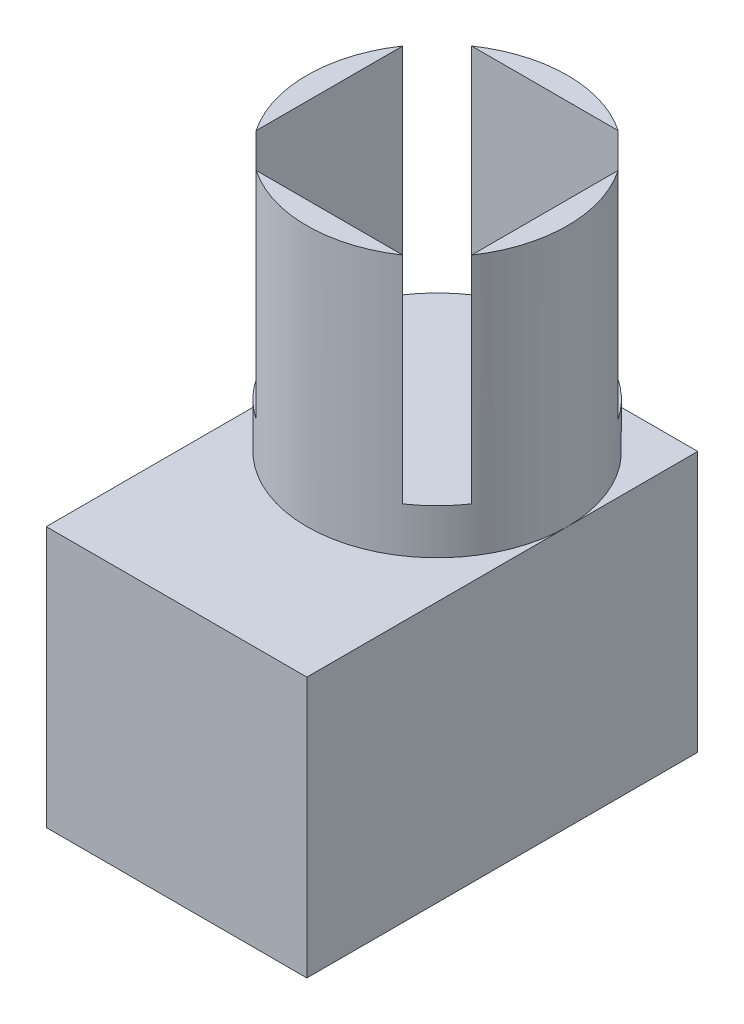
ISO-10303-21;
HEADER;
FILE_DESCRIPTION(('STEP AP214'),'2;1');
FILE_NAME('part.step','',(''),(''),'','','');
FILE_SCHEMA(('AUTOMOTIVE_DESIGN { 1 0 10303 214 1 1 1 1 }'));
ENDSEC;
DATA;
#1=APPLICATION_CONTEXT('core data for automotive mechanical design processes');
#2=APPLICATION_PROTOCOL_DEFINITION('international standard','automotive_design',2000,#1);
#3=PRODUCT_CONTEXT('',#1,'mechanical');
#4=PRODUCT('Part','Part','',(#3));
#5=PRODUCT_RELATED_PRODUCT_CATEGORY('part','',(#4));
#6=PRODUCT_DEFINITION_FORMATION('','',#4);
#7=PRODUCT_DEFINITION_CONTEXT('part definition',#1,'design');
#8=PRODUCT_DEFINITION('design','',#6,#7);
#9=PRODUCT_DEFINITION_SHAPE('','',#8);
#10=(LENGTH_UNIT() NAMED_UNIT(*) SI_UNIT(.MILLI.,.METRE.));
#11=(NAMED_UNIT(*) PLANE_ANGLE_UNIT() SI_UNIT($,.RADIAN.));
#12=(NAMED_UNIT(*) SI_UNIT($,.STERADIAN.) SOLID_ANGLE_UNIT());
#13=UNCERTAINTY_MEASURE_WITH_UNIT(LENGTH_MEASURE(1.E-05),#10,'distance_accuracy_value','');
#14=(GEOMETRIC_REPRESENTATION_CONTEXT(3) GLOBAL_UNCERTAINTY_ASSIGNED_CONTEXT((#13)) GLOBAL_UNIT_ASSIGNED_CONTEXT((#10,
#11,#12)) REPRESENTATION_CONTEXT('',''));
#15=CARTESIAN_POINT('',(0.,0.,0.));
#16=DIRECTION('',(0.,0.,1.));
#17=DIRECTION('',(1.,0.,0.));
#18=AXIS2_PLACEMENT_3D('',#15,#16,#17);
#19=CARTESIAN_POINT('',(0.,101.6,0.));
#20=DIRECTION('',(0.,1.,0.));
#21=DIRECTION('',(0.,0.,1.));
#22=AXIS2_PLACEMENT_3D('',#19,#20,#21);
#23=PLANE('',#22);
#24=DIRECTION('',(0.,0.,-1.));
#25=VECTOR('',#24,1.);
#26=CARTESIAN_POINT('',(21.0058,101.6,0.));
#27=LINE('',#26,#25);
#28=CARTESIAN_POINT('',(21.0058,101.6,14.2799287939401));
#29=VERTEX_POINT('',#28);
#30=CARTESIAN_POINT('',(21.0058,101.6,-14.2799287939401));
#31=VERTEX_POINT('',#30);
#32=EDGE_CURVE('E337',#29,#31,#27,.T.);
#33=ORIENTED_EDGE('',*,*,#32,.F.);
#34=CARTESIAN_POINT('',(0.,101.6,0.));
#35=DIRECTION('',(0.,1.,0.));
#36=DIRECTION('',(0.,0.,1.));
#37=AXIS2_PLACEMENT_3D('',#34,#35,#36);
#38=CIRCLE('',#37,25.4);
#39=EDGE_CURVE('E330',#29,#31,#38,.T.);
#40=ORIENTED_EDGE('',*,*,#39,.T.);
#41=EDGE_LOOP('',(#33,#40));
#42=FACE_BOUND('',#41,.T.);
#43=ADVANCED_FACE('F39',(#42),#23,.T.);
#44=DIRECTION('',(1.,0.,0.));
#45=VECTOR('',#44,1.);
#46=CARTESIAN_POINT('',(0.,101.6,21.0058));
#47=LINE('',#46,#45);
#48=CARTESIAN_POINT('',(-14.2799287939401,101.6,21.0058));
#49=VERTEX_POINT('',#48);
#50=CARTESIAN_POINT('',(14.2799287939401,101.6,21.0058));
#51=VERTEX_POINT('',#50);
#52=EDGE_CURVE('E335',#49,#51,#47,.T.);
#53=ORIENTED_EDGE('',*,*,#52,.F.);
#54=EDGE_CURVE('E326',#49,#51,#38,.T.);
#55=ORIENTED_EDGE('',*,*,#54,.T.);
#56=EDGE_LOOP('',(#53,#55));
#57=FACE_BOUND('',#56,.T.);
#58=ADVANCED_FACE('F387',(#57),#23,.T.);
#59=DIRECTION('',(0.,0.,1.));
#60=VECTOR('',#59,1.);
#61=CARTESIAN_POINT('',(-21.0058,101.6,0.));
#62=LINE('',#61,#60);
#63=CARTESIAN_POINT('',(-21.0058,101.6,-14.2799287939401));
#64=VERTEX_POINT('',#63);
#65=CARTESIAN_POINT('',(-21.0058,101.6,14.2799287939401));
#66=VERTEX_POINT('',#65);
#67=EDGE_CURVE('E333',#64,#66,#62,.T.);
#68=ORIENTED_EDGE('',*,*,#67,.F.);
#69=EDGE_CURVE('E329',#64,#66,#38,.T.);
#70=ORIENTED_EDGE('',*,*,#69,.T.);
#71=EDGE_LOOP('',(#68,#70));
#72=FACE_BOUND('',#71,.T.);
#73=ADVANCED_FACE('F368',(#72),#23,.T.);
#74=CARTESIAN_POINT('',(0.,101.6,0.));
#75=DIRECTION('',(0.,-1.,0.));
#76=DIRECTION('',(0.,0.,-1.));
#77=AXIS2_PLACEMENT_3D('',#74,#75,#76);
#78=CYLINDRICAL_SURFACE('',#77,25.4);
#79=CARTESIAN_POINT('',(0.,50.8,0.));
#80=DIRECTION('',(0.,1.,0.));
#81=DIRECTION('',(0.,0.,1.));
#82=AXIS2_PLACEMENT_3D('',#79,#80,#81);
#83=CIRCLE('',#82,25.4);
#84=CARTESIAN_POINT('',(-25.4,50.8,0.));
#85=VERTEX_POINT('',#84);
#86=CARTESIAN_POINT('',(25.4,50.8,0.));
#87=VERTEX_POINT('',#86);
#88=EDGE_CURVE('E43',#85,#87,#83,.T.);
#89=ORIENTED_EDGE('',*,*,#88,.T.);
#90=CARTESIAN_POINT('',(0.,50.8,-25.4));
#91=VERTEX_POINT('',#90);
#92=EDGE_CURVE('E11',#87,#91,#83,.T.);
#93=ORIENTED_EDGE('',*,*,#92,.T.);
#94=EDGE_CURVE('E48',#91,#85,#83,.T.);
#95=ORIENTED_EDGE('',*,*,#94,.T.);
#96=EDGE_LOOP('',(#89,#93,#95));
#97=FACE_BOUND('',#96,.T.);
#98=CARTESIAN_POINT('',(0.,59.5884,0.));
#99=DIRECTION('',(0.,-1.,0.));
#100=DIRECTION('',(0.,0.,-1.));
#101=AXIS2_PLACEMENT_3D('',#98,#99,#100);
#102=CIRCLE('',#101,25.4);
#103=CARTESIAN_POINT('',(14.2799287939401,59.5884,-21.0058));
#104=VERTEX_POINT('',#103);
#105=CARTESIAN_POINT('',(21.0058,59.5884,-14.2799287939401));
#106=VERTEX_POINT('',#105);
#107=EDGE_CURVE('E341',#104,#106,#102,.T.);
#108=ORIENTED_EDGE('',*,*,#107,.T.);
#109=DIRECTION('',(0.,-1.,0.));
#110=VECTOR('',#109,1.);
#111=CARTESIAN_POINT('',(21.0058,101.6,-14.2799287939401));
#112=LINE('',#111,#110);
#113=EDGE_CURVE('E320',#106,#31,#112,.F.);
#114=ORIENTED_EDGE('',*,*,#113,.T.);
#115=ORIENTED_EDGE('',*,*,#39,.F.);
#116=DIRECTION('',(0.,-1.,0.));
#117=VECTOR('',#116,1.);
#118=CARTESIAN_POINT('',(21.0058,101.6,14.2799287939401));
#119=LINE('',#118,#117);
#120=CARTESIAN_POINT('',(21.0058,59.5884,14.2799287939401));
#121=VERTEX_POINT('',#120);
#122=EDGE_CURVE('E323',#29,#121,#119,.T.);
#123=ORIENTED_EDGE('',*,*,#122,.T.);
#124=CARTESIAN_POINT('',(14.2799287939401,59.5884,21.0058));
#125=VERTEX_POINT('',#124);
#126=EDGE_CURVE('E344',#121,#125,#102,.T.);
#127=ORIENTED_EDGE('',*,*,#126,.T.);
#128=DIRECTION('',(0.,-1.,0.));
#129=VECTOR('',#128,1.);
#130=CARTESIAN_POINT('',(14.2799287939401,101.6,21.0058));
#131=LINE('',#130,#129);
#132=EDGE_CURVE('E314',#125,#51,#131,.F.);
#133=ORIENTED_EDGE('',*,*,#132,.T.);
#134=ORIENTED_EDGE('',*,*,#54,.F.);
#135=DIRECTION('',(0.,-1.,0.));
#136=VECTOR('',#135,1.);
#137=CARTESIAN_POINT('',(-14.2799287939401,101.6,21.0058));
#138=LINE('',#137,#136);
#139=CARTESIAN_POINT('',(-14.2799287939401,59.5884,21.0058));
#140=VERTEX_POINT('',#139);
#141=EDGE_CURVE('E317',#49,#140,#138,.T.);
#142=ORIENTED_EDGE('',*,*,#141,.T.);
#143=CARTESIAN_POINT('',(-21.0058,59.5884,14.2799287939401));
#144=VERTEX_POINT('',#143);
#145=EDGE_CURVE('E340',#140,#144,#102,.T.);
#146=ORIENTED_EDGE('',*,*,#145,.T.);
#147=DIRECTION('',(0.,-1.,0.));
#148=VECTOR('',#147,1.);
#149=CARTESIAN_POINT('',(-21.0058,101.6,14.2799287939401));
#150=LINE('',#149,#148);
#151=EDGE_CURVE('E308',#144,#66,#150,.F.);
#152=ORIENTED_EDGE('',*,*,#151,.T.);
#153=ORIENTED_EDGE('',*,*,#69,.F.);
#154=DIRECTION('',(0.,-1.,0.));
#155=VECTOR('',#154,1.);
#156=CARTESIAN_POINT('',(-21.0058,101.6,-14.2799287939401));
#157=LINE('',#156,#155);
#158=CARTESIAN_POINT('',(-21.0058,59.5884,-14.2799287939401));
#159=VERTEX_POINT('',#158);
#160=EDGE_CURVE('E311',#64,#159,#157,.T.);
#161=ORIENTED_EDGE('',*,*,#160,.T.);
#162=CARTESIAN_POINT('',(-14.2799287939401,59.5884,-21.0058));
#163=VERTEX_POINT('',#162);
#164=EDGE_CURVE('E338',#159,#163,#102,.T.);
#165=ORIENTED_EDGE('',*,*,#164,.T.);
#166=DIRECTION('',(0.,-1.,0.));
#167=VECTOR('',#166,1.);
#168=CARTESIAN_POINT('',(-14.2799287939401,101.6,-21.0058));
#169=LINE('',#168,#167);
#170=CARTESIAN_POINT('',(-14.2799287939401,101.6,-21.0058));
#171=VERTEX_POINT('',#170);
#172=EDGE_CURVE('E302',#163,#171,#169,.F.);
#173=ORIENTED_EDGE('',*,*,#172,.T.);
#174=CARTESIAN_POINT('',(14.2799287939401,101.6,-21.0058));
#175=VERTEX_POINT('',#174);
#176=EDGE_CURVE('E359',#175,#171,#38,.T.);
#177=ORIENTED_EDGE('',*,*,#176,.F.);
#178=DIRECTION('',(0.,-1.,0.));
#179=VECTOR('',#178,1.);
#180=CARTESIAN_POINT('',(14.2799287939401,101.6,-21.0058));
#181=LINE('',#180,#179);
#182=EDGE_CURVE('E305',#175,#104,#181,.T.);
#183=ORIENTED_EDGE('',*,*,#182,.T.);
#184=EDGE_LOOP('',(#108,#114,#115,#123,#127,#133,#134,#142,#146,#152,#153,#161,#165,#173,#177,#183));
#185=FACE_BOUND('',#184,.T.);
#186=ADVANCED_FACE('F41',(#97,#185),#78,.T.);
#187=DIRECTION('',(-1.,0.,0.));
#188=VECTOR('',#187,1.);
#189=CARTESIAN_POINT('',(0.,101.6,-21.0058));
#190=LINE('',#189,#188);
#191=EDGE_CURVE('E331',#175,#171,#190,.T.);
#192=ORIENTED_EDGE('',*,*,#191,.F.);
#193=ORIENTED_EDGE('',*,*,#176,.T.);
#194=EDGE_LOOP('',(#192,#193));
#195=FACE_BOUND('',#194,.T.);
#196=ADVANCED_FACE('F375',(#195),#23,.T.);
#197=CARTESIAN_POINT('',(0.,59.5884,0.));
#198=DIRECTION('',(0.,-1.,0.));
#199=DIRECTION('',(0.,0.,-1.));
#200=AXIS2_PLACEMENT_3D('',#197,#198,#199);
#201=PLANE('',#200);
#202=DIRECTION('',(-1.,0.,0.));
#203=VECTOR('',#202,1.);
#204=CARTESIAN_POINT('',(-21.0058,59.5884,-21.0058));
#205=LINE('',#204,#203);
#206=EDGE_CURVE('E293',#104,#163,#205,.T.);
#207=ORIENTED_EDGE('',*,*,#206,.T.);
#208=ORIENTED_EDGE('',*,*,#164,.F.);
#209=DIRECTION('',(0.,0.,1.));
#210=VECTOR('',#209,1.);
#211=CARTESIAN_POINT('',(-21.0058,59.5884,21.0058));
#212=LINE('',#211,#210);
#213=EDGE_CURVE('E296',#159,#144,#212,.T.);
#214=ORIENTED_EDGE('',*,*,#213,.T.);
#215=ORIENTED_EDGE('',*,*,#145,.F.);
#216=DIRECTION('',(1.,0.,0.));
#217=VECTOR('',#216,1.);
#218=CARTESIAN_POINT('',(-21.0058,59.5884,21.0058));
#219=LINE('',#218,#217);
#220=EDGE_CURVE('E299',#140,#125,#219,.T.);
#221=ORIENTED_EDGE('',*,*,#220,.T.);
#222=ORIENTED_EDGE('',*,*,#126,.F.);
#223=DIRECTION('',(0.,0.,-1.));
#224=VECTOR('',#223,1.);
#225=CARTESIAN_POINT('',(21.0058,59.5884,21.0058));
#226=LINE('',#225,#224);
#227=EDGE_CURVE('E282',#121,#106,#226,.T.);
#228=ORIENTED_EDGE('',*,*,#227,.T.);
#229=ORIENTED_EDGE('',*,*,#107,.F.);
#230=EDGE_LOOP('',(#207,#208,#214,#215,#221,#222,#228,#229));
#231=FACE_BOUND('',#230,.T.);
#232=ADVANCED_FACE('F352',(#231),#201,.F.);
#233=CARTESIAN_POINT('',(21.0058,59.5884,21.0058));
#234=DIRECTION('',(1.,0.,0.));
#235=DIRECTION('',(0.,0.,-1.));
#236=AXIS2_PLACEMENT_3D('',#233,#234,#235);
#237=PLANE('',#236);
#238=ORIENTED_EDGE('',*,*,#32,.T.);
#239=ORIENTED_EDGE('',*,*,#113,.F.);
#240=ORIENTED_EDGE('',*,*,#227,.F.);
#241=ORIENTED_EDGE('',*,*,#122,.F.);
#242=EDGE_LOOP('',(#238,#239,#240,#241));
#243=FACE_BOUND('',#242,.T.);
#244=ADVANCED_FACE('F355',(#243),#237,.F.);
#245=CARTESIAN_POINT('',(-21.0058,59.5884,21.0058));
#246=DIRECTION('',(0.,0.,1.));
#247=DIRECTION('',(1.,0.,0.));
#248=AXIS2_PLACEMENT_3D('',#245,#246,#247);
#249=PLANE('',#248);
#250=ORIENTED_EDGE('',*,*,#52,.T.);
#251=ORIENTED_EDGE('',*,*,#132,.F.);
#252=ORIENTED_EDGE('',*,*,#220,.F.);
#253=ORIENTED_EDGE('',*,*,#141,.F.);
#254=EDGE_LOOP('',(#250,#251,#252,#253));
#255=FACE_BOUND('',#254,.T.);
#256=ADVANCED_FACE('F396',(#255),#249,.F.);
#257=CARTESIAN_POINT('',(-21.0058,59.5884,21.0058));
#258=DIRECTION('',(-1.,0.,0.));
#259=DIRECTION('',(0.,0.,1.));
#260=AXIS2_PLACEMENT_3D('',#257,#258,#259);
#261=PLANE('',#260);
#262=ORIENTED_EDGE('',*,*,#67,.T.);
#263=ORIENTED_EDGE('',*,*,#151,.F.);
#264=ORIENTED_EDGE('',*,*,#213,.F.);
#265=ORIENTED_EDGE('',*,*,#160,.F.);
#266=EDGE_LOOP('',(#262,#263,#264,#265));
#267=FACE_BOUND('',#266,.T.);
#268=ADVANCED_FACE('F371',(#267),#261,.F.);
#269=CARTESIAN_POINT('',(-21.0058,59.5884,-21.0058));
#270=DIRECTION('',(0.,0.,-1.));
#271=DIRECTION('',(-1.,0.,0.));
#272=AXIS2_PLACEMENT_3D('',#269,#270,#271);
#273=PLANE('',#272);
#274=ORIENTED_EDGE('',*,*,#191,.T.);
#275=ORIENTED_EDGE('',*,*,#172,.F.);
#276=ORIENTED_EDGE('',*,*,#206,.F.);
#277=ORIENTED_EDGE('',*,*,#182,.F.);
#278=EDGE_LOOP('',(#274,#275,#276,#277));
#279=FACE_BOUND('',#278,.T.);
#280=ADVANCED_FACE('F374',(#279),#273,.F.);
#281=CARTESIAN_POINT('',(0.,50.8,0.));
#282=DIRECTION('',(0.,1.,0.));
#283=DIRECTION('',(0.,0.,1.));
#284=AXIS2_PLACEMENT_3D('',#281,#282,#283);
#285=PLANE('',#284);
#286=ORIENTED_EDGE('',*,*,#92,.F.);
#287=DIRECTION('',(0.,0.,1.));
#288=VECTOR('',#287,1.);
#289=CARTESIAN_POINT('',(25.4,50.8,-25.4));
#290=LINE('',#289,#288);
#291=CARTESIAN_POINT('',(25.4,50.8,-25.4));
#292=VERTEX_POINT('',#291);
#293=EDGE_CURVE('E264',#292,#87,#290,.T.);
#294=ORIENTED_EDGE('',*,*,#293,.F.);
#295=DIRECTION('',(1.,0.,0.));
#296=VECTOR('',#295,1.);
#297=CARTESIAN_POINT('',(-25.4,50.8,-25.4));
#298=LINE('',#297,#296);
#299=EDGE_CURVE('E258',#91,#292,#298,.T.);
#300=ORIENTED_EDGE('',*,*,#299,.F.);
#301=EDGE_LOOP('',(#286,#294,#300));
#302=FACE_BOUND('',#301,.T.);
#303=ADVANCED_FACE('F407',(#302),#285,.T.);
#304=ORIENTED_EDGE('',*,*,#94,.F.);
#305=CARTESIAN_POINT('',(-25.4,50.8,-25.4));
#306=VERTEX_POINT('',#305);
#307=EDGE_CURVE('E260',#306,#91,#298,.T.);
#308=ORIENTED_EDGE('',*,*,#307,.F.);
#309=DIRECTION('',(0.,0.,-1.));
#310=VECTOR('',#309,1.);
#311=CARTESIAN_POINT('',(-25.4,50.8,-25.4));
#312=LINE('',#311,#310);
#313=EDGE_CURVE('E259',#85,#306,#312,.T.);
#314=ORIENTED_EDGE('',*,*,#313,.F.);
#315=EDGE_LOOP('',(#304,#308,#314));
#316=FACE_BOUND('',#315,.T.);
#317=ADVANCED_FACE('F411',(#316),#285,.T.);
#318=CARTESIAN_POINT('',(-25.4,50.8,-25.4));
#319=DIRECTION('',(-1.,0.,0.));
#320=DIRECTION('',(0.,0.,1.));
#321=AXIS2_PLACEMENT_3D('',#318,#319,#320);
#322=PLANE('',#321);
#323=DIRECTION('',(0.,-1.,0.));
#324=VECTOR('',#323,1.);
#325=CARTESIAN_POINT('',(-25.4,5.08,-15.24));
#326=LINE('',#325,#324);
#327=CARTESIAN_POINT('',(-25.4,16.51,-15.24));
#328=VERTEX_POINT('',#327);
#329=CARTESIAN_POINT('',(-25.4,5.08,-15.24));
#330=VERTEX_POINT('',#329);
#331=EDGE_CURVE('E55',#328,#330,#326,.T.);
#332=ORIENTED_EDGE('',*,*,#331,.F.);
#333=DIRECTION('',(0.,0.,-1.));
#334=VECTOR('',#333,1.);
#335=CARTESIAN_POINT('',(-25.4,16.51,-15.24));
#336=LINE('',#335,#334);
#337=CARTESIAN_POINT('',(-25.4,16.51,-5.842));
#338=VERTEX_POINT('',#337);
#339=EDGE_CURVE('E194',#338,#328,#336,.T.);
#340=ORIENTED_EDGE('',*,*,#339,.F.);
#341=DIRECTION('',(0.,1.,0.));
#342=VECTOR('',#341,1.);
#343=CARTESIAN_POINT('',(-25.4,5.08000000000001,-5.842));
#344=LINE('',#343,#342);
#345=CARTESIAN_POINT('',(-25.4,5.08000000000001,-5.842));
#346=VERTEX_POINT('',#345);
#347=EDGE_CURVE('E214',#346,#338,#344,.T.);
#348=ORIENTED_EDGE('',*,*,#347,.F.);
#349=DIRECTION('',(0.,0.,1.));
#350=VECTOR('',#349,1.);
#351=CARTESIAN_POINT('',(-25.4,5.08,-15.24));
#352=LINE('',#351,#350);
#353=EDGE_CURVE('E208',#330,#346,#352,.T.);
#354=ORIENTED_EDGE('',*,*,#353,.F.);
#355=EDGE_LOOP('',(#332,#340,#348,#354));
#356=FACE_BOUND('',#355,.T.);
#357=DIRECTION('',(0.,0.,-1.));
#358=VECTOR('',#357,1.);
#359=CARTESIAN_POINT('',(-25.4,0.,-25.4));
#360=LINE('',#359,#358);
#361=CARTESIAN_POINT('',(-25.4,0.,50.8));
#362=VERTEX_POINT('',#361);
#363=CARTESIAN_POINT('',(-25.4,0.,-25.4));
#364=VERTEX_POINT('',#363);
#365=EDGE_CURVE('E248',#362,#364,#360,.T.);
#366=ORIENTED_EDGE('',*,*,#365,.F.);
#367=DIRECTION('',(0.,-1.,0.));
#368=VECTOR('',#367,1.);
#369=CARTESIAN_POINT('',(-25.4,50.8,50.8));
#370=LINE('',#369,#368);
#371=CARTESIAN_POINT('',(-25.4,50.8,50.8));
#372=VERTEX_POINT('',#371);
#373=EDGE_CURVE('E279',#372,#362,#370,.T.);
#374=ORIENTED_EDGE('',*,*,#373,.F.);
#375=EDGE_CURVE('E255',#372,#85,#312,.T.);
#376=ORIENTED_EDGE('',*,*,#375,.T.);
#377=ORIENTED_EDGE('',*,*,#313,.T.);
#378=DIRECTION('',(0.,-1.,0.));
#379=VECTOR('',#378,1.);
#380=CARTESIAN_POINT('',(-25.4,50.8,-25.4));
#381=LINE('',#380,#379);
#382=EDGE_CURVE('E269',#306,#364,#381,.T.);
#383=ORIENTED_EDGE('',*,*,#382,.T.);
#384=EDGE_LOOP('',(#366,#374,#376,#377,#383));
#385=FACE_BOUND('',#384,.T.);
#386=ADVANCED_FACE('F418',(#356,#385),#322,.T.);
#387=CARTESIAN_POINT('',(25.4,50.8,-25.4));
#388=DIRECTION('',(1.,0.,0.));
#389=DIRECTION('',(0.,0.,-1.));
#390=AXIS2_PLACEMENT_3D('',#387,#388,#389);
#391=PLANE('',#390);
#392=DIRECTION('',(0.,-1.,0.));
#393=VECTOR('',#392,1.);
#394=CARTESIAN_POINT('',(25.4,50.8,50.8));
#395=LINE('',#394,#393);
#396=CARTESIAN_POINT('',(25.4,50.8,50.8));
#397=VERTEX_POINT('',#396);
#398=CARTESIAN_POINT('',(25.4,0.,50.8));
#399=VERTEX_POINT('',#398);
#400=EDGE_CURVE('E283',#397,#399,#395,.T.);
#401=ORIENTED_EDGE('',*,*,#400,.T.);
#402=DIRECTION('',(0.,0.,1.));
#403=VECTOR('',#402,1.);
#404=CARTESIAN_POINT('',(25.4,0.,-25.4));
#405=LINE('',#404,#403);
#406=CARTESIAN_POINT('',(25.4,0.,-25.4));
#407=VERTEX_POINT('',#406);
#408=EDGE_CURVE('E274',#407,#399,#405,.T.);
#409=ORIENTED_EDGE('',*,*,#408,.F.);
#410=DIRECTION('',(0.,-1.,0.));
#411=VECTOR('',#410,1.);
#412=CARTESIAN_POINT('',(25.4,50.8,-25.4));
#413=LINE('',#412,#411);
#414=EDGE_CURVE('E286',#292,#407,#413,.T.);
#415=ORIENTED_EDGE('',*,*,#414,.F.);
#416=ORIENTED_EDGE('',*,*,#293,.T.);
#417=EDGE_CURVE('E263',#87,#397,#290,.T.);
#418=ORIENTED_EDGE('',*,*,#417,.T.);
#419=EDGE_LOOP('',(#401,#409,#415,#416,#418));
#420=FACE_BOUND('',#419,.T.);
#421=ADVANCED_FACE('F451',(#420),#391,.T.);
#422=CARTESIAN_POINT('',(-25.4,50.8,-25.4));
#423=DIRECTION('',(0.,0.,-1.));
#424=DIRECTION('',(-1.,0.,0.));
#425=AXIS2_PLACEMENT_3D('',#422,#423,#424);
#426=PLANE('',#425);
#427=DIRECTION('',(1.,0.,0.));
#428=VECTOR('',#427,1.);
#429=CARTESIAN_POINT('',(-25.4,0.,-25.4));
#430=LINE('',#429,#428);
#431=EDGE_CURVE('E272',#364,#407,#430,.T.);
#432=ORIENTED_EDGE('',*,*,#431,.F.);
#433=ORIENTED_EDGE('',*,*,#382,.F.);
#434=ORIENTED_EDGE('',*,*,#307,.T.);
#435=ORIENTED_EDGE('',*,*,#299,.T.);
#436=ORIENTED_EDGE('',*,*,#414,.T.);
#437=EDGE_LOOP('',(#432,#433,#434,#435,#436));
#438=FACE_BOUND('',#437,.T.);
#439=ADVANCED_FACE('F432',(#438),#426,.T.);
#440=CARTESIAN_POINT('',(-25.4,50.8,50.8));
#441=DIRECTION('',(0.,0.,1.));
#442=DIRECTION('',(1.,0.,0.));
#443=AXIS2_PLACEMENT_3D('',#440,#441,#442);
#444=PLANE('',#443);
#445=DIRECTION('',(-1.,0.,0.));
#446=VECTOR('',#445,1.);
#447=CARTESIAN_POINT('',(-25.4,0.,50.8));
#448=LINE('',#447,#446);
#449=EDGE_CURVE('E276',#399,#362,#448,.T.);
#450=ORIENTED_EDGE('',*,*,#449,.F.);
#451=ORIENTED_EDGE('',*,*,#400,.F.);
#452=DIRECTION('',(-1.,0.,0.));
#453=VECTOR('',#452,1.);
#454=CARTESIAN_POINT('',(-25.4,50.8,50.8));
#455=LINE('',#454,#453);
#456=EDGE_CURVE('E266',#397,#372,#455,.T.);
#457=ORIENTED_EDGE('',*,*,#456,.T.);
#458=ORIENTED_EDGE('',*,*,#373,.T.);
#459=EDGE_LOOP('',(#450,#451,#457,#458));
#460=FACE_BOUND('',#459,.T.);
#461=ADVANCED_FACE('F425',(#460),#444,.T.);
#462=ORIENTED_EDGE('',*,*,#88,.F.);
#463=ORIENTED_EDGE('',*,*,#375,.F.);
#464=ORIENTED_EDGE('',*,*,#456,.F.);
#465=ORIENTED_EDGE('',*,*,#417,.F.);
#466=EDGE_LOOP('',(#462,#463,#464,#465));
#467=FACE_BOUND('',#466,.T.);
#468=ADVANCED_FACE('F414',(#467),#285,.T.);
#469=CARTESIAN_POINT('',(0.,0.,0.));
#470=DIRECTION('',(0.,1.,0.));
#471=DIRECTION('',(0.,0.,1.));
#472=AXIS2_PLACEMENT_3D('',#469,#470,#471);
#473=PLANE('',#472);
#474=DIRECTION('',(1.,0.,0.));
#475=VECTOR('',#474,1.);
#476=CARTESIAN_POINT('',(-21.59,0.,-21.59));
#477=LINE('',#476,#475);
#478=CARTESIAN_POINT('',(-21.59,0.,-21.59));
#479=VERTEX_POINT('',#478);
#480=CARTESIAN_POINT('',(21.59,0.,-21.59));
#481=VERTEX_POINT('',#480);
#482=EDGE_CURVE('E238',#479,#481,#477,.T.);
#483=ORIENTED_EDGE('',*,*,#482,.F.);
#484=DIRECTION('',(0.,0.,-1.));
#485=VECTOR('',#484,1.);
#486=CARTESIAN_POINT('',(-21.59,0.,46.99));
#487=LINE('',#486,#485);
#488=CARTESIAN_POINT('',(-21.59,0.,46.99));
#489=VERTEX_POINT('',#488);
#490=EDGE_CURVE('E200',#489,#479,#487,.T.);
#491=ORIENTED_EDGE('',*,*,#490,.F.);
#492=DIRECTION('',(-1.,0.,0.));
#493=VECTOR('',#492,1.);
#494=CARTESIAN_POINT('',(-21.59,0.,46.99));
#495=LINE('',#494,#493);
#496=CARTESIAN_POINT('',(21.59,0.,46.99));
#497=VERTEX_POINT('',#496);
#498=EDGE_CURVE('E227',#497,#489,#495,.T.);
#499=ORIENTED_EDGE('',*,*,#498,.F.);
#500=DIRECTION('',(0.,0.,1.));
#501=VECTOR('',#500,1.);
#502=CARTESIAN_POINT('',(21.59,0.,46.99));
#503=LINE('',#502,#501);
#504=EDGE_CURVE('E241',#481,#497,#503,.T.);
#505=ORIENTED_EDGE('',*,*,#504,.F.);
#506=EDGE_LOOP('',(#483,#491,#499,#505));
#507=FACE_BOUND('',#506,.T.);
#508=ORIENTED_EDGE('',*,*,#365,.T.);
#509=ORIENTED_EDGE('',*,*,#431,.T.);
#510=ORIENTED_EDGE('',*,*,#408,.T.);
#511=ORIENTED_EDGE('',*,*,#449,.T.);
#512=EDGE_LOOP('',(#508,#509,#510,#511));
#513=FACE_BOUND('',#512,.T.);
#514=ADVANCED_FACE('F424',(#507,#513),#473,.F.);
#515=CARTESIAN_POINT('',(-21.59,44.45,46.99));
#516=DIRECTION('',(-1.,0.,0.));
#517=DIRECTION('',(0.,0.,1.));
#518=AXIS2_PLACEMENT_3D('',#515,#516,#517);
#519=PLANE('',#518);
#520=DIRECTION('',(0.,0.,1.));
#521=VECTOR('',#520,1.);
#522=CARTESIAN_POINT('',(-21.59,16.51,-15.24));
#523=LINE('',#522,#521);
#524=CARTESIAN_POINT('',(-21.59,16.51,-15.24));
#525=VERTEX_POINT('',#524);
#526=CARTESIAN_POINT('',(-21.59,16.51,-5.842));
#527=VERTEX_POINT('',#526);
#528=EDGE_CURVE('E206',#525,#527,#523,.T.);
#529=ORIENTED_EDGE('',*,*,#528,.F.);
#530=DIRECTION('',(0.,1.,0.));
#531=VECTOR('',#530,1.);
#532=CARTESIAN_POINT('',(-21.59,5.08,-15.24));
#533=LINE('',#532,#531);
#534=CARTESIAN_POINT('',(-21.59,5.08,-15.24));
#535=VERTEX_POINT('',#534);
#536=EDGE_CURVE('E188',#535,#525,#533,.T.);
#537=ORIENTED_EDGE('',*,*,#536,.F.);
#538=DIRECTION('',(0.,0.,-1.));
#539=VECTOR('',#538,1.);
#540=CARTESIAN_POINT('',(-21.59,5.08,-15.24));
#541=LINE('',#540,#539);
#542=CARTESIAN_POINT('',(-21.59,5.08000000000001,-5.842));
#543=VERTEX_POINT('',#542);
#544=EDGE_CURVE('E197',#543,#535,#541,.T.);
#545=ORIENTED_EDGE('',*,*,#544,.F.);
#546=DIRECTION('',(0.,-1.,0.));
#547=VECTOR('',#546,1.);
#548=CARTESIAN_POINT('',(-21.59,5.08000000000001,-5.842));
#549=LINE('',#548,#547);
#550=EDGE_CURVE('E63',#527,#543,#549,.T.);
#551=ORIENTED_EDGE('',*,*,#550,.F.);
#552=EDGE_LOOP('',(#529,#537,#545,#551));
#553=FACE_BOUND('',#552,.T.);
#554=ORIENTED_EDGE('',*,*,#490,.T.);
#555=DIRECTION('',(0.,-1.,0.));
#556=VECTOR('',#555,1.);
#557=CARTESIAN_POINT('',(-21.59,44.45,-21.59));
#558=LINE('',#557,#556);
#559=CARTESIAN_POINT('',(-21.59,44.45,-21.59));
#560=VERTEX_POINT('',#559);
#561=EDGE_CURVE('E236',#560,#479,#558,.T.);
#562=ORIENTED_EDGE('',*,*,#561,.F.);
#563=DIRECTION('',(0.,0.,-1.));
#564=VECTOR('',#563,1.);
#565=CARTESIAN_POINT('',(-21.59,44.45,46.99));
#566=LINE('',#565,#564);
#567=CARTESIAN_POINT('',(-21.59,44.45,46.99));
#568=VERTEX_POINT('',#567);
#569=EDGE_CURVE('E223',#568,#560,#566,.T.);
#570=ORIENTED_EDGE('',*,*,#569,.F.);
#571=DIRECTION('',(0.,-1.,0.));
#572=VECTOR('',#571,1.);
#573=CARTESIAN_POINT('',(-21.59,44.45,46.99));
#574=LINE('',#573,#572);
#575=EDGE_CURVE('E246',#568,#489,#574,.T.);
#576=ORIENTED_EDGE('',*,*,#575,.T.);
#577=EDGE_LOOP('',(#554,#562,#570,#576));
#578=FACE_BOUND('',#577,.T.);
#579=ADVANCED_FACE('F203',(#553,#578),#519,.F.);
#580=CARTESIAN_POINT('',(-21.59,44.45,46.99));
#581=DIRECTION('',(0.,0.,1.));
#582=DIRECTION('',(1.,0.,0.));
#583=AXIS2_PLACEMENT_3D('',#580,#581,#582);
#584=PLANE('',#583);
#585=ORIENTED_EDGE('',*,*,#498,.T.);
#586=ORIENTED_EDGE('',*,*,#575,.F.);
#587=DIRECTION('',(-1.,0.,0.));
#588=VECTOR('',#587,1.);
#589=CARTESIAN_POINT('',(-21.59,44.45,46.99));
#590=LINE('',#589,#588);
#591=CARTESIAN_POINT('',(21.59,44.45,46.99));
#592=VERTEX_POINT('',#591);
#593=EDGE_CURVE('E233',#592,#568,#590,.T.);
#594=ORIENTED_EDGE('',*,*,#593,.F.);
#595=DIRECTION('',(0.,-1.,0.));
#596=VECTOR('',#595,1.);
#597=CARTESIAN_POINT('',(21.59,44.45,46.99));
#598=LINE('',#597,#596);
#599=EDGE_CURVE('E249',#592,#497,#598,.T.);
#600=ORIENTED_EDGE('',*,*,#599,.T.);
#601=EDGE_LOOP('',(#585,#586,#594,#600));
#602=FACE_BOUND('',#601,.T.);
#603=ADVANCED_FACE('F484',(#602),#584,.F.);
#604=CARTESIAN_POINT('',(21.59,44.45,46.99));
#605=DIRECTION('',(1.,0.,0.));
#606=DIRECTION('',(0.,0.,-1.));
#607=AXIS2_PLACEMENT_3D('',#604,#605,#606);
#608=PLANE('',#607);
#609=ORIENTED_EDGE('',*,*,#504,.T.);
#610=ORIENTED_EDGE('',*,*,#599,.F.);
#611=DIRECTION('',(0.,0.,1.));
#612=VECTOR('',#611,1.);
#613=CARTESIAN_POINT('',(21.59,44.45,46.99));
#614=LINE('',#613,#612);
#615=CARTESIAN_POINT('',(21.59,44.45,-21.59));
#616=VERTEX_POINT('',#615);
#617=EDGE_CURVE('E230',#616,#592,#614,.T.);
#618=ORIENTED_EDGE('',*,*,#617,.F.);
#619=DIRECTION('',(0.,-1.,0.));
#620=VECTOR('',#619,1.);
#621=CARTESIAN_POINT('',(21.59,44.45,-21.59));
#622=LINE('',#621,#620);
#623=EDGE_CURVE('E251',#616,#481,#622,.T.);
#624=ORIENTED_EDGE('',*,*,#623,.T.);
#625=EDGE_LOOP('',(#609,#610,#618,#624));
#626=FACE_BOUND('',#625,.T.);
#627=ADVANCED_FACE('F487',(#626),#608,.F.);
#628=CARTESIAN_POINT('',(-21.59,44.45,-21.59));
#629=DIRECTION('',(0.,0.,-1.));
#630=DIRECTION('',(-1.,0.,0.));
#631=AXIS2_PLACEMENT_3D('',#628,#629,#630);
#632=PLANE('',#631);
#633=ORIENTED_EDGE('',*,*,#482,.T.);
#634=ORIENTED_EDGE('',*,*,#623,.F.);
#635=DIRECTION('',(1.,0.,0.));
#636=VECTOR('',#635,1.);
#637=CARTESIAN_POINT('',(-21.59,44.45,-21.59));
#638=LINE('',#637,#636);
#639=EDGE_CURVE('E226',#560,#616,#638,.T.);
#640=ORIENTED_EDGE('',*,*,#639,.F.);
#641=ORIENTED_EDGE('',*,*,#561,.T.);
#642=EDGE_LOOP('',(#633,#634,#640,#641));
#643=FACE_BOUND('',#642,.T.);
#644=ADVANCED_FACE('F482',(#643),#632,.F.);
#645=CARTESIAN_POINT('',(0.,44.45,0.));
#646=DIRECTION('',(0.,-1.,0.));
#647=DIRECTION('',(0.,0.,-1.));
#648=AXIS2_PLACEMENT_3D('',#645,#646,#647);
#649=PLANE('',#648);
#650=ORIENTED_EDGE('',*,*,#569,.T.);
#651=ORIENTED_EDGE('',*,*,#639,.T.);
#652=ORIENTED_EDGE('',*,*,#617,.T.);
#653=ORIENTED_EDGE('',*,*,#593,.T.);
#654=EDGE_LOOP('',(#650,#651,#652,#653));
#655=FACE_BOUND('',#654,.T.);
#656=ADVANCED_FACE('F476',(#655),#649,.T.);
#657=CARTESIAN_POINT('',(25.401,5.08,-15.24));
#658=DIRECTION('',(0.,0.,-1.));
#659=DIRECTION('',(-1.,0.,0.));
#660=AXIS2_PLACEMENT_3D('',#657,#658,#659);
#661=PLANE('',#660);
#662=ORIENTED_EDGE('',*,*,#536,.T.);
#663=DIRECTION('',(-1.,0.,0.));
#664=VECTOR('',#663,1.);
#665=CARTESIAN_POINT('',(25.401,16.51,-15.24));
#666=LINE('',#665,#664);
#667=EDGE_CURVE('E201',#525,#328,#666,.T.);
#668=ORIENTED_EDGE('',*,*,#667,.T.);
#669=ORIENTED_EDGE('',*,*,#331,.T.);
#670=DIRECTION('',(-1.,0.,0.));
#671=VECTOR('',#670,1.);
#672=CARTESIAN_POINT('',(25.401,5.08,-15.24));
#673=LINE('',#672,#671);
#674=EDGE_CURVE('E184',#535,#330,#673,.T.);
#675=ORIENTED_EDGE('',*,*,#674,.F.);
#676=EDGE_LOOP('',(#662,#668,#669,#675));
#677=FACE_BOUND('',#676,.T.);
#678=ADVANCED_FACE('F186',(#677),#661,.F.);
#679=CARTESIAN_POINT('',(25.401,16.51,-15.24));
#680=DIRECTION('',(0.,1.,0.));
#681=DIRECTION('',(0.,0.,1.));
#682=AXIS2_PLACEMENT_3D('',#679,#680,#681);
#683=PLANE('',#682);
#684=ORIENTED_EDGE('',*,*,#528,.T.);
#685=DIRECTION('',(-1.,0.,0.));
#686=VECTOR('',#685,1.);
#687=CARTESIAN_POINT('',(25.401,16.51,-5.842));
#688=LINE('',#687,#686);
#689=EDGE_CURVE('E220',#527,#338,#688,.T.);
#690=ORIENTED_EDGE('',*,*,#689,.T.);
#691=ORIENTED_EDGE('',*,*,#339,.T.);
#692=ORIENTED_EDGE('',*,*,#667,.F.);
#693=EDGE_LOOP('',(#684,#690,#691,#692));
#694=FACE_BOUND('',#693,.T.);
#695=ADVANCED_FACE('F468',(#694),#683,.F.);
#696=CARTESIAN_POINT('',(25.401,5.08000000000001,-5.842));
#697=DIRECTION('',(0.,0.,1.));
#698=DIRECTION('',(1.,0.,0.));
#699=AXIS2_PLACEMENT_3D('',#696,#697,#698);
#700=PLANE('',#699);
#701=ORIENTED_EDGE('',*,*,#550,.T.);
#702=DIRECTION('',(-1.,0.,0.));
#703=VECTOR('',#702,1.);
#704=CARTESIAN_POINT('',(25.401,5.08000000000001,-5.842));
#705=LINE('',#704,#703);
#706=EDGE_CURVE('E193',#543,#346,#705,.T.);
#707=ORIENTED_EDGE('',*,*,#706,.T.);
#708=ORIENTED_EDGE('',*,*,#347,.T.);
#709=ORIENTED_EDGE('',*,*,#689,.F.);
#710=EDGE_LOOP('',(#701,#707,#708,#709));
#711=FACE_BOUND('',#710,.T.);
#712=ADVANCED_FACE('F466',(#711),#700,.F.);
#713=CARTESIAN_POINT('',(25.401,5.08,-15.24));
#714=DIRECTION('',(0.,-1.,0.));
#715=DIRECTION('',(0.,0.,-1.));
#716=AXIS2_PLACEMENT_3D('',#713,#714,#715);
#717=PLANE('',#716);
#718=ORIENTED_EDGE('',*,*,#544,.T.);
#719=ORIENTED_EDGE('',*,*,#674,.T.);
#720=ORIENTED_EDGE('',*,*,#353,.T.);
#721=ORIENTED_EDGE('',*,*,#706,.F.);
#722=EDGE_LOOP('',(#718,#719,#720,#721));
#723=FACE_BOUND('',#722,.T.);
#724=ADVANCED_FACE('F198',(#723),#717,.F.);
#725=CLOSED_SHELL('',(#43,#58,#73,#186,#196,#232,#244,#256,#268,#280,#303,#317,#386,#421,#439,
#461,#468,#514,#579,#603,#627,#644,#656,#678,#695,#712,#724));
#726=MANIFOLD_SOLID_BREP('B2',#725);
#727=ADVANCED_BREP_SHAPE_REPRESENTATION('',(#18,#726),#14);
#728=SHAPE_DEFINITION_REPRESENTATION(#9,#727);
ENDSEC;
END-ISO-10303-21;
